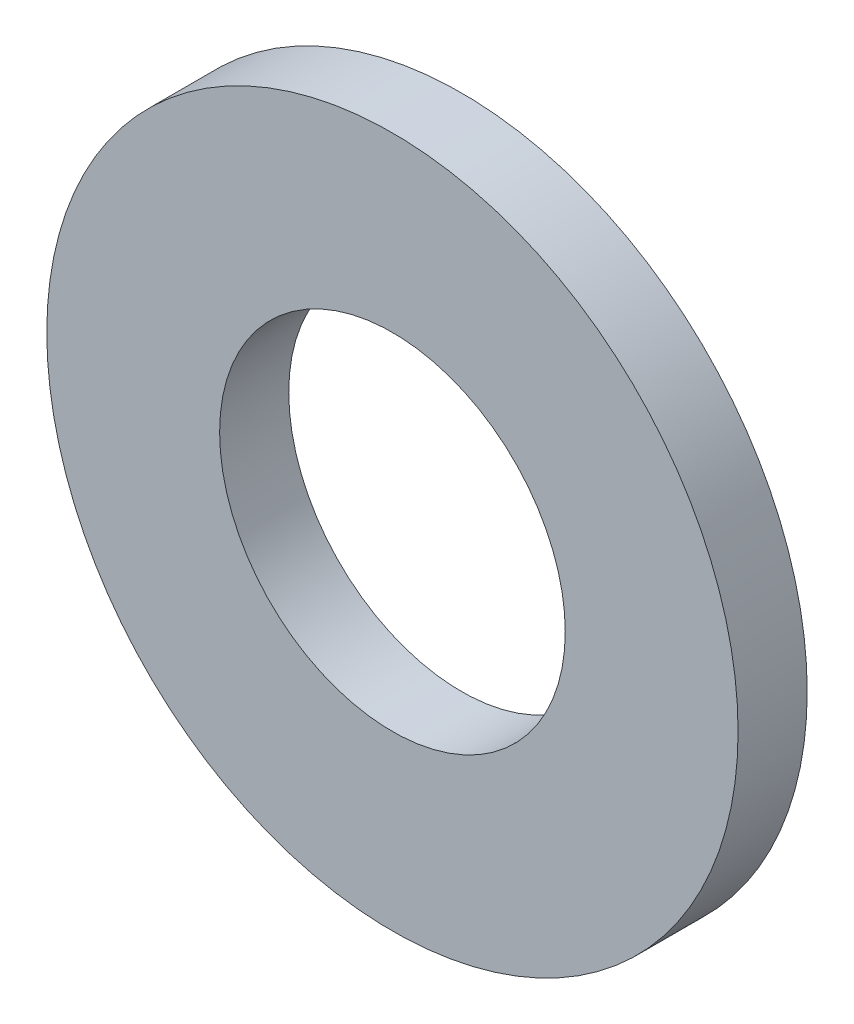
ISO-10303-21;
HEADER;
FILE_DESCRIPTION(('STEP AP214'),'2;1');
FILE_NAME('part.step','',(''),(''),'','','');
FILE_SCHEMA(('AUTOMOTIVE_DESIGN { 1 0 10303 214 1 1 1 1 }'));
ENDSEC;
DATA;
#1=APPLICATION_CONTEXT('core data for automotive mechanical design processes');
#2=APPLICATION_PROTOCOL_DEFINITION('international standard','automotive_design',2000,#1);
#3=PRODUCT_CONTEXT('',#1,'mechanical');
#4=PRODUCT('Part','Part','',(#3));
#5=PRODUCT_RELATED_PRODUCT_CATEGORY('part','',(#4));
#6=PRODUCT_DEFINITION_FORMATION('','',#4);
#7=PRODUCT_DEFINITION_CONTEXT('part definition',#1,'design');
#8=PRODUCT_DEFINITION('design','',#6,#7);
#9=PRODUCT_DEFINITION_SHAPE('','',#8);
#10=(LENGTH_UNIT() NAMED_UNIT(*) SI_UNIT(.MILLI.,.METRE.));
#11=(NAMED_UNIT(*) PLANE_ANGLE_UNIT() SI_UNIT($,.RADIAN.));
#12=(NAMED_UNIT(*) SI_UNIT($,.STERADIAN.) SOLID_ANGLE_UNIT());
#13=UNCERTAINTY_MEASURE_WITH_UNIT(LENGTH_MEASURE(1.E-05),#10,'distance_accuracy_value','');
#14=(GEOMETRIC_REPRESENTATION_CONTEXT(3) GLOBAL_UNCERTAINTY_ASSIGNED_CONTEXT((#13)) GLOBAL_UNIT_ASSIGNED_CONTEXT((#10,
#11,#12)) REPRESENTATION_CONTEXT('',''));
#15=CARTESIAN_POINT('',(0.,0.,0.));
#16=DIRECTION('',(0.,0.,1.));
#17=DIRECTION('',(1.,0.,0.));
#18=AXIS2_PLACEMENT_3D('',#15,#16,#17);
#19=CARTESIAN_POINT('',(0.,0.,1.2));
#20=DIRECTION('',(0.,0.,-1.));
#21=DIRECTION('',(-1.,0.,0.));
#22=AXIS2_PLACEMENT_3D('',#19,#20,#21);
#23=CYLINDRICAL_SURFACE('',#22,6.);
#24=CARTESIAN_POINT('',(0.,0.,1.2));
#25=DIRECTION('',(0.,0.,1.));
#26=DIRECTION('',(1.,0.,0.));
#27=AXIS2_PLACEMENT_3D('',#24,#25,#26);
#28=CIRCLE('',#27,6.);
#29=CARTESIAN_POINT('',(6.,0.,1.2));
#30=VERTEX_POINT('',#29);
#31=EDGE_CURVE('E10',#30,#30,#28,.T.);
#32=ORIENTED_EDGE('',*,*,#31,.F.);
#33=EDGE_LOOP('',(#32));
#34=FACE_BOUND('',#33,.T.);
#35=CARTESIAN_POINT('',(0.,0.,0.));
#36=DIRECTION('',(0.,0.,1.));
#37=DIRECTION('',(1.,0.,0.));
#38=AXIS2_PLACEMENT_3D('',#35,#36,#37);
#39=CIRCLE('',#38,6.);
#40=CARTESIAN_POINT('',(6.,0.,0.));
#41=VERTEX_POINT('',#40);
#42=EDGE_CURVE('E34',#41,#41,#39,.T.);
#43=ORIENTED_EDGE('',*,*,#42,.T.);
#44=EDGE_LOOP('',(#43));
#45=FACE_BOUND('',#44,.T.);
#46=ADVANCED_FACE('F31',(#34,#45),#23,.T.);
#47=CARTESIAN_POINT('',(0.,0.,1.2));
#48=DIRECTION('',(0.,0.,1.));
#49=DIRECTION('',(1.,0.,0.));
#50=AXIS2_PLACEMENT_3D('',#47,#48,#49);
#51=PLANE('',#50);
#52=CARTESIAN_POINT('',(0.,0.,1.2));
#53=DIRECTION('',(0.,0.,1.));
#54=DIRECTION('',(1.,0.,0.));
#55=AXIS2_PLACEMENT_3D('',#52,#53,#54);
#56=CIRCLE('',#55,3.);
#57=CARTESIAN_POINT('',(3.,0.,1.2));
#58=VERTEX_POINT('',#57);
#59=EDGE_CURVE('E43',#58,#58,#56,.T.);
#60=ORIENTED_EDGE('',*,*,#59,.F.);
#61=EDGE_LOOP('',(#60));
#62=FACE_BOUND('',#61,.T.);
#63=ORIENTED_EDGE('',*,*,#31,.T.);
#64=EDGE_LOOP('',(#63));
#65=FACE_BOUND('',#64,.T.);
#66=ADVANCED_FACE('F58',(#62,#65),#51,.T.);
#67=CARTESIAN_POINT('',(0.,0.,0.));
#68=DIRECTION('',(0.,0.,1.));
#69=DIRECTION('',(1.,0.,0.));
#70=AXIS2_PLACEMENT_3D('',#67,#68,#69);
#71=PLANE('',#70);
#72=CARTESIAN_POINT('',(0.,0.,0.));
#73=DIRECTION('',(0.,0.,1.));
#74=DIRECTION('',(1.,0.,0.));
#75=AXIS2_PLACEMENT_3D('',#72,#73,#74);
#76=CIRCLE('',#75,3.);
#77=CARTESIAN_POINT('',(3.,0.,0.));
#78=VERTEX_POINT('',#77);
#79=EDGE_CURVE('E41',#78,#78,#76,.T.);
#80=ORIENTED_EDGE('',*,*,#79,.T.);
#81=EDGE_LOOP('',(#80));
#82=FACE_BOUND('',#81,.T.);
#83=ORIENTED_EDGE('',*,*,#42,.F.);
#84=EDGE_LOOP('',(#83));
#85=FACE_BOUND('',#84,.T.);
#86=ADVANCED_FACE('F49',(#82,#85),#71,.F.);
#87=CARTESIAN_POINT('',(0.,0.,0.));
#88=DIRECTION('',(0.,0.,1.));
#89=DIRECTION('',(1.,0.,0.));
#90=AXIS2_PLACEMENT_3D('',#87,#88,#89);
#91=CYLINDRICAL_SURFACE('',#90,3.);
#92=ORIENTED_EDGE('',*,*,#79,.F.);
#93=EDGE_LOOP('',(#92));
#94=FACE_BOUND('',#93,.T.);
#95=ORIENTED_EDGE('',*,*,#59,.T.);
#96=EDGE_LOOP('',(#95));
#97=FACE_BOUND('',#96,.T.);
#98=ADVANCED_FACE('F52',(#94,#97),#91,.F.);
#99=CLOSED_SHELL('',(#46,#66,#86,#98));
#100=MANIFOLD_SOLID_BREP('B2',#99);
#101=ADVANCED_BREP_SHAPE_REPRESENTATION('',(#18,#100),#14);
#102=SHAPE_DEFINITION_REPRESENTATION(#9,#101);
ENDSEC;
END-ISO-10303-21;
